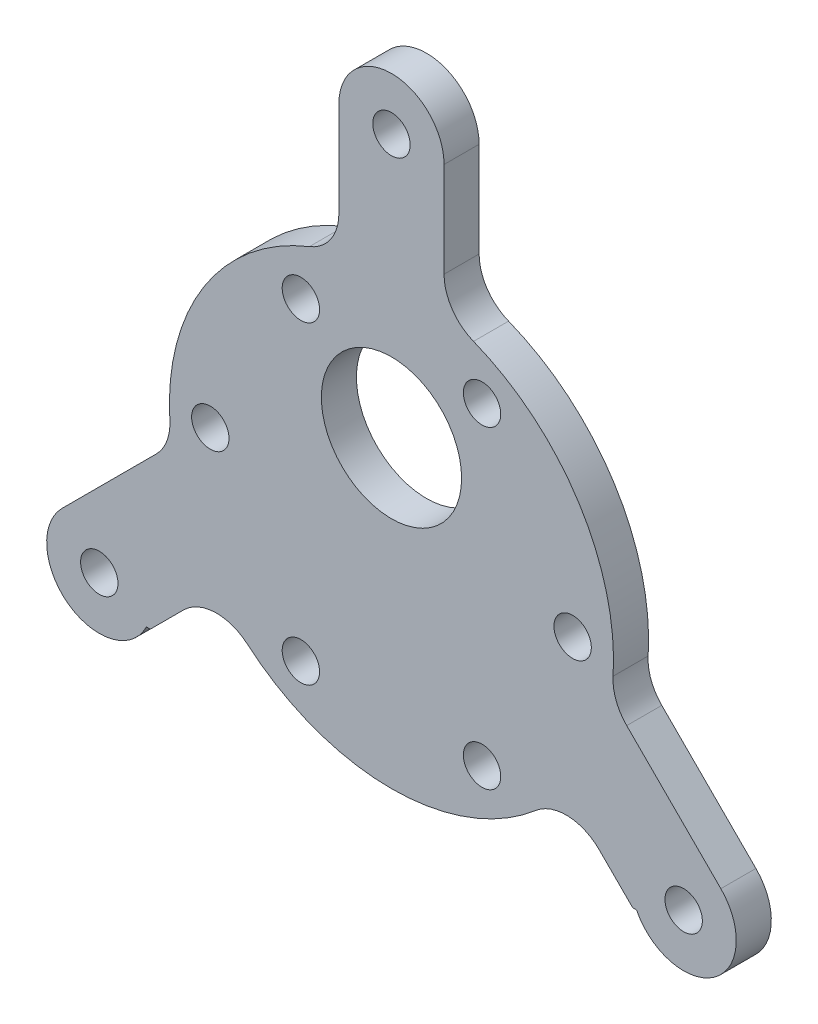
ISO-10303-21;
HEADER;
FILE_DESCRIPTION(('STEP AP214'),'2;1');
FILE_NAME('part.step','',(''),(''),'','','');
FILE_SCHEMA(('AUTOMOTIVE_DESIGN { 1 0 10303 214 1 1 1 1 }'));
ENDSEC;
DATA;
#1=APPLICATION_CONTEXT('core data for automotive mechanical design processes');
#2=APPLICATION_PROTOCOL_DEFINITION('international standard','automotive_design',2000,#1);
#3=PRODUCT_CONTEXT('',#1,'mechanical');
#4=PRODUCT('Part','Part','',(#3));
#5=PRODUCT_RELATED_PRODUCT_CATEGORY('part','',(#4));
#6=PRODUCT_DEFINITION_FORMATION('','',#4);
#7=PRODUCT_DEFINITION_CONTEXT('part definition',#1,'design');
#8=PRODUCT_DEFINITION('design','',#6,#7);
#9=PRODUCT_DEFINITION_SHAPE('','',#8);
#10=(LENGTH_UNIT() NAMED_UNIT(*) SI_UNIT(.MILLI.,.METRE.));
#11=(NAMED_UNIT(*) PLANE_ANGLE_UNIT() SI_UNIT($,.RADIAN.));
#12=(NAMED_UNIT(*) SI_UNIT($,.STERADIAN.) SOLID_ANGLE_UNIT());
#13=UNCERTAINTY_MEASURE_WITH_UNIT(LENGTH_MEASURE(1.E-05),#10,'distance_accuracy_value','');
#14=(GEOMETRIC_REPRESENTATION_CONTEXT(3) GLOBAL_UNCERTAINTY_ASSIGNED_CONTEXT((#13)) GLOBAL_UNIT_ASSIGNED_CONTEXT((#10,
#11,#12)) REPRESENTATION_CONTEXT('',''));
#15=CARTESIAN_POINT('',(0.,0.,0.));
#16=DIRECTION('',(0.,0.,1.));
#17=DIRECTION('',(1.,0.,0.));
#18=AXIS2_PLACEMENT_3D('',#15,#16,#17);
#19=CARTESIAN_POINT('',(20.5680194846604,20.5680194846605,3.));
#20=DIRECTION('',(-0.707106781186546,-0.707106781186549,0.));
#21=DIRECTION('',(0.707106781186549,-0.707106781186546,0.));
#22=AXIS2_PLACEMENT_3D('',#19,#20,#21);
#23=PLANE('',#22);
#24=DIRECTION('',(-0.707106781186549,0.707106781186546,0.));
#25=VECTOR('',#24,1.);
#26=CARTESIAN_POINT('',(20.5680194846604,20.5680194846605,3.));
#27=LINE('',#26,#25);
#28=CARTESIAN_POINT('',(65.6360389693211,-24.5,3.));
#29=VERTEX_POINT('',#28);
#30=CARTESIAN_POINT('',(62.7825614942522,-21.6465225249311,3.));
#31=VERTEX_POINT('',#30);
#32=EDGE_CURVE('E176',#29,#31,#27,.T.);
#33=ORIENTED_EDGE('',*,*,#32,.T.);
#34=DIRECTION('',(0.,0.,-1.));
#35=VECTOR('',#34,1.);
#36=CARTESIAN_POINT('',(62.7825614942522,-21.6465225249311,3.));
#37=LINE('',#36,#35);
#38=CARTESIAN_POINT('',(62.7825614942522,-21.6465225249311,0.));
#39=VERTEX_POINT('',#38);
#40=EDGE_CURVE('E339',#31,#39,#37,.T.);
#41=ORIENTED_EDGE('',*,*,#40,.T.);
#42=DIRECTION('',(-0.707106781186549,0.707106781186546,0.));
#43=VECTOR('',#42,1.);
#44=CARTESIAN_POINT('',(20.5680194846604,20.5680194846605,0.));
#45=LINE('',#44,#43);
#46=CARTESIAN_POINT('',(65.6360389693211,-24.5,0.));
#47=VERTEX_POINT('',#46);
#48=EDGE_CURVE('E179',#47,#39,#45,.T.);
#49=ORIENTED_EDGE('',*,*,#48,.F.);
#50=DIRECTION('',(0.,0.,-1.));
#51=VECTOR('',#50,1.);
#52=CARTESIAN_POINT('',(65.6360389693211,-24.5,3.));
#53=LINE('',#52,#51);
#54=EDGE_CURVE('E172',#29,#47,#53,.T.);
#55=ORIENTED_EDGE('',*,*,#54,.F.);
#56=EDGE_LOOP('',(#33,#41,#49,#55));
#57=FACE_BOUND('',#56,.T.);
#58=ADVANCED_FACE('F35',(#57),#23,.T.);
#59=CARTESIAN_POINT('',(0.,-24.5,3.));
#60=DIRECTION('',(0.,1.,0.));
#61=DIRECTION('',(-1.,0.,0.));
#62=AXIS2_PLACEMENT_3D('',#59,#60,#61);
#63=PLANE('',#62);
#64=DIRECTION('',(1.,0.,0.));
#65=VECTOR('',#64,1.);
#66=CARTESIAN_POINT('',(0.,-24.5,0.));
#67=LINE('',#66,#65);
#68=CARTESIAN_POINT('',(65.9688711258507,-24.5,0.));
#69=VERTEX_POINT('',#68);
#70=EDGE_CURVE('E262',#47,#69,#67,.T.);
#71=ORIENTED_EDGE('',*,*,#70,.T.);
#72=DIRECTION('',(0.,0.,-1.));
#73=VECTOR('',#72,1.);
#74=CARTESIAN_POINT('',(65.9688711258507,-24.5,3.));
#75=LINE('',#74,#73);
#76=CARTESIAN_POINT('',(65.9688711258507,-24.5,3.));
#77=VERTEX_POINT('',#76);
#78=EDGE_CURVE('E183',#77,#69,#75,.T.);
#79=ORIENTED_EDGE('',*,*,#78,.F.);
#80=DIRECTION('',(1.,0.,0.));
#81=VECTOR('',#80,1.);
#82=CARTESIAN_POINT('',(0.,-24.5,3.));
#83=LINE('',#82,#81);
#84=EDGE_CURVE('E186',#29,#77,#83,.T.);
#85=ORIENTED_EDGE('',*,*,#84,.F.);
#86=ORIENTED_EDGE('',*,*,#54,.T.);
#87=EDGE_LOOP('',(#71,#79,#85,#86));
#88=FACE_BOUND('',#87,.T.);
#89=ADVANCED_FACE('F187',(#88),#63,.F.);
#90=CARTESIAN_POINT('',(70.,-22.5,3.));
#91=DIRECTION('',(0.,0.,-1.));
#92=DIRECTION('',(-1.,0.,0.));
#93=AXIS2_PLACEMENT_3D('',#90,#91,#92);
#94=CYLINDRICAL_SURFACE('',#93,4.5);
#95=CARTESIAN_POINT('',(70.,-22.5,0.));
#96=DIRECTION('',(0.,0.,1.));
#97=DIRECTION('',(1.,0.,0.));
#98=AXIS2_PLACEMENT_3D('',#95,#96,#97);
#99=CIRCLE('',#98,4.5);
#100=CARTESIAN_POINT('',(73.1819805153395,-19.3180194846605,0.));
#101=VERTEX_POINT('',#100);
#102=EDGE_CURVE('E264',#69,#101,#99,.T.);
#103=ORIENTED_EDGE('',*,*,#102,.T.);
#104=DIRECTION('',(0.,0.,-1.));
#105=VECTOR('',#104,1.);
#106=CARTESIAN_POINT('',(73.1819805153395,-19.3180194846605,3.));
#107=LINE('',#106,#105);
#108=CARTESIAN_POINT('',(73.1819805153395,-19.3180194846605,3.));
#109=VERTEX_POINT('',#108);
#110=EDGE_CURVE('E329',#109,#101,#107,.T.);
#111=ORIENTED_EDGE('',*,*,#110,.F.);
#112=CARTESIAN_POINT('',(70.,-22.5,3.));
#113=DIRECTION('',(0.,0.,1.));
#114=DIRECTION('',(1.,0.,0.));
#115=AXIS2_PLACEMENT_3D('',#112,#113,#114);
#116=CIRCLE('',#115,4.5);
#117=EDGE_CURVE('E191',#77,#109,#116,.T.);
#118=ORIENTED_EDGE('',*,*,#117,.F.);
#119=ORIENTED_EDGE('',*,*,#78,.T.);
#120=EDGE_LOOP('',(#103,#111,#118,#119));
#121=FACE_BOUND('',#120,.T.);
#122=ADVANCED_FACE('F410',(#121),#94,.T.);
#123=CARTESIAN_POINT('',(26.9319805153393,26.9319805153394,3.));
#124=DIRECTION('',(-0.707106781186546,-0.707106781186548,0.));
#125=DIRECTION('',(0.707106781186549,-0.707106781186546,0.));
#126=AXIS2_PLACEMENT_3D('',#123,#124,#125);
#127=PLANE('',#126);
#128=DIRECTION('',(-0.707106781186549,0.707106781186546,0.));
#129=VECTOR('',#128,1.);
#130=CARTESIAN_POINT('',(26.9319805153393,26.9319805153394,0.));
#131=LINE('',#130,#129);
#132=CARTESIAN_POINT('',(65.1268002113902,-11.2628391807113,0.));
#133=VERTEX_POINT('',#132);
#134=EDGE_CURVE('E266',#101,#133,#131,.T.);
#135=ORIENTED_EDGE('',*,*,#134,.T.);
#136=DIRECTION('',(0.,0.,1.));
#137=VECTOR('',#136,1.);
#138=CARTESIAN_POINT('',(65.1268002113902,-11.2628391807113,3.));
#139=LINE('',#138,#137);
#140=CARTESIAN_POINT('',(65.1268002113902,-11.2628391807113,3.));
#141=VERTEX_POINT('',#140);
#142=EDGE_CURVE('E337',#133,#141,#139,.T.);
#143=ORIENTED_EDGE('',*,*,#142,.T.);
#144=DIRECTION('',(-0.707106781186549,0.707106781186546,0.));
#145=VECTOR('',#144,1.);
#146=CARTESIAN_POINT('',(26.9319805153393,26.9319805153394,3.));
#147=LINE('',#146,#145);
#148=EDGE_CURVE('E205',#109,#141,#147,.T.);
#149=ORIENTED_EDGE('',*,*,#148,.F.);
#150=ORIENTED_EDGE('',*,*,#110,.T.);
#151=EDGE_LOOP('',(#135,#143,#149,#150));
#152=FACE_BOUND('',#151,.T.);
#153=ADVANCED_FACE('F418',(#152),#127,.F.);
#154=CARTESIAN_POINT('',(45.,-7.,3.));
#155=DIRECTION('',(0.,0.,-1.));
#156=DIRECTION('',(-1.,0.,0.));
#157=AXIS2_PLACEMENT_3D('',#154,#155,#156);
#158=CYLINDRICAL_SURFACE('',#157,19.);
#159=CARTESIAN_POINT('',(45.,-7.,3.));
#160=DIRECTION('',(0.,0.,1.));
#161=DIRECTION('',(1.,0.,0.));
#162=AXIS2_PLACEMENT_3D('',#159,#160,#161);
#163=CIRCLE('',#162,19.);
#164=CARTESIAN_POINT('',(63.9630138863735,-8.18494908971029,3.));
#165=VERTEX_POINT('',#164);
#166=CARTESIAN_POINT('',(52.0217391304348,10.6548910952212,3.));
#167=VERTEX_POINT('',#166);
#168=EDGE_CURVE('E208',#165,#167,#163,.T.);
#169=ORIENTED_EDGE('',*,*,#168,.F.);
#170=DIRECTION('',(0.,0.,-1.));
#171=VECTOR('',#170,1.);
#172=CARTESIAN_POINT('',(63.9630138863735,-8.18494908971029,3.));
#173=LINE('',#172,#171);
#174=CARTESIAN_POINT('',(63.9630138863735,-8.18494908971029,0.));
#175=VERTEX_POINT('',#174);
#176=EDGE_CURVE('E334',#165,#175,#173,.T.);
#177=ORIENTED_EDGE('',*,*,#176,.T.);
#178=CARTESIAN_POINT('',(45.,-7.,0.));
#179=DIRECTION('',(0.,0.,1.));
#180=DIRECTION('',(1.,0.,0.));
#181=AXIS2_PLACEMENT_3D('',#178,#179,#180);
#182=CIRCLE('',#181,19.);
#183=CARTESIAN_POINT('',(52.0217391304348,10.6548910952212,0.));
#184=VERTEX_POINT('',#183);
#185=EDGE_CURVE('E269',#175,#184,#182,.T.);
#186=ORIENTED_EDGE('',*,*,#185,.T.);
#187=DIRECTION('',(0.,0.,-1.));
#188=VECTOR('',#187,1.);
#189=CARTESIAN_POINT('',(52.0217391304348,10.6548910952212,3.));
#190=LINE('',#189,#188);
#191=EDGE_CURVE('E182',#184,#167,#190,.F.);
#192=ORIENTED_EDGE('',*,*,#191,.T.);
#193=EDGE_LOOP('',(#169,#177,#186,#192));
#194=FACE_BOUND('',#193,.T.);
#195=ADVANCED_FACE('F396',(#194),#158,.T.);
#196=CARTESIAN_POINT('',(49.5,0.,3.));
#197=DIRECTION('',(1.,0.,0.));
#198=DIRECTION('',(0.,1.,0.));
#199=AXIS2_PLACEMENT_3D('',#196,#197,#198);
#200=PLANE('',#199);
#201=DIRECTION('',(0.,-1.,0.));
#202=VECTOR('',#201,1.);
#203=CARTESIAN_POINT('',(49.5,0.,3.));
#204=LINE('',#203,#202);
#205=CARTESIAN_POINT('',(49.5,22.5,3.));
#206=VERTEX_POINT('',#205);
#207=CARTESIAN_POINT('',(49.5,14.3717102731625,3.));
#208=VERTEX_POINT('',#207);
#209=EDGE_CURVE('E215',#206,#208,#204,.T.);
#210=ORIENTED_EDGE('',*,*,#209,.T.);
#211=DIRECTION('',(0.,0.,-1.));
#212=VECTOR('',#211,1.);
#213=CARTESIAN_POINT('',(49.5,14.3717102731625,3.));
#214=LINE('',#213,#212);
#215=CARTESIAN_POINT('',(49.5,14.3717102731625,0.));
#216=VERTEX_POINT('',#215);
#217=EDGE_CURVE('E356',#208,#216,#214,.T.);
#218=ORIENTED_EDGE('',*,*,#217,.T.);
#219=DIRECTION('',(0.,-1.,0.));
#220=VECTOR('',#219,1.);
#221=CARTESIAN_POINT('',(49.5,0.,0.));
#222=LINE('',#221,#220);
#223=CARTESIAN_POINT('',(49.5,22.5,0.));
#224=VERTEX_POINT('',#223);
#225=EDGE_CURVE('E276',#224,#216,#222,.T.);
#226=ORIENTED_EDGE('',*,*,#225,.F.);
#227=DIRECTION('',(0.,0.,-1.));
#228=VECTOR('',#227,1.);
#229=CARTESIAN_POINT('',(49.5,22.5,3.));
#230=LINE('',#229,#228);
#231=EDGE_CURVE('E327',#206,#224,#230,.T.);
#232=ORIENTED_EDGE('',*,*,#231,.F.);
#233=EDGE_LOOP('',(#210,#218,#226,#232));
#234=FACE_BOUND('',#233,.T.);
#235=ADVANCED_FACE('F386',(#234),#200,.T.);
#236=CARTESIAN_POINT('',(45.,22.5,3.));
#237=DIRECTION('',(0.,0.,-1.));
#238=DIRECTION('',(-1.,0.,0.));
#239=AXIS2_PLACEMENT_3D('',#236,#237,#238);
#240=CYLINDRICAL_SURFACE('',#239,4.5);
#241=CARTESIAN_POINT('',(45.,22.5,0.));
#242=DIRECTION('',(0.,0.,1.));
#243=DIRECTION('',(1.,0.,0.));
#244=AXIS2_PLACEMENT_3D('',#241,#242,#243);
#245=CIRCLE('',#244,4.5);
#246=CARTESIAN_POINT('',(40.5,22.5,0.));
#247=VERTEX_POINT('',#246);
#248=EDGE_CURVE('E279',#224,#247,#245,.T.);
#249=ORIENTED_EDGE('',*,*,#248,.T.);
#250=DIRECTION('',(0.,0.,-1.));
#251=VECTOR('',#250,1.);
#252=CARTESIAN_POINT('',(40.5,22.5,3.));
#253=LINE('',#252,#251);
#254=CARTESIAN_POINT('',(40.5,22.5,3.));
#255=VERTEX_POINT('',#254);
#256=EDGE_CURVE('E324',#255,#247,#253,.T.);
#257=ORIENTED_EDGE('',*,*,#256,.F.);
#258=CARTESIAN_POINT('',(45.,22.5,3.));
#259=DIRECTION('',(0.,0.,1.));
#260=DIRECTION('',(1.,0.,0.));
#261=AXIS2_PLACEMENT_3D('',#258,#259,#260);
#262=CIRCLE('',#261,4.5);
#263=EDGE_CURVE('E218',#206,#255,#262,.T.);
#264=ORIENTED_EDGE('',*,*,#263,.F.);
#265=ORIENTED_EDGE('',*,*,#231,.T.);
#266=EDGE_LOOP('',(#249,#257,#264,#265));
#267=FACE_BOUND('',#266,.T.);
#268=ADVANCED_FACE('F501',(#267),#240,.T.);
#269=CARTESIAN_POINT('',(40.5,0.,3.));
#270=DIRECTION('',(1.,0.,0.));
#271=DIRECTION('',(0.,1.,0.));
#272=AXIS2_PLACEMENT_3D('',#269,#270,#271);
#273=PLANE('',#272);
#274=DIRECTION('',(0.,-1.,0.));
#275=VECTOR('',#274,1.);
#276=CARTESIAN_POINT('',(40.5,0.,0.));
#277=LINE('',#276,#275);
#278=CARTESIAN_POINT('',(40.5,14.3717102731625,0.));
#279=VERTEX_POINT('',#278);
#280=EDGE_CURVE('E274',#247,#279,#277,.T.);
#281=ORIENTED_EDGE('',*,*,#280,.T.);
#282=DIRECTION('',(0.,0.,1.));
#283=VECTOR('',#282,1.);
#284=CARTESIAN_POINT('',(40.5,14.3717102731625,3.));
#285=LINE('',#284,#283);
#286=CARTESIAN_POINT('',(40.5,14.3717102731625,3.));
#287=VERTEX_POINT('',#286);
#288=EDGE_CURVE('E50',#279,#287,#285,.T.);
#289=ORIENTED_EDGE('',*,*,#288,.T.);
#290=DIRECTION('',(0.,-1.,0.));
#291=VECTOR('',#290,1.);
#292=CARTESIAN_POINT('',(40.5,0.,3.));
#293=LINE('',#292,#291);
#294=EDGE_CURVE('E213',#255,#287,#293,.T.);
#295=ORIENTED_EDGE('',*,*,#294,.F.);
#296=ORIENTED_EDGE('',*,*,#256,.T.);
#297=EDGE_LOOP('',(#281,#289,#295,#296));
#298=FACE_BOUND('',#297,.T.);
#299=ADVANCED_FACE('F498',(#298),#273,.F.);
#300=CARTESIAN_POINT('',(37.9782608695652,10.6548910952212,0.));
#301=VERTEX_POINT('',#300);
#302=CARTESIAN_POINT('',(26.0369861136265,-8.18494908971029,0.));
#303=VERTEX_POINT('',#302);
#304=EDGE_CURVE('E270',#301,#303,#182,.T.);
#305=ORIENTED_EDGE('',*,*,#304,.T.);
#306=DIRECTION('',(0.,0.,-1.));
#307=VECTOR('',#306,1.);
#308=CARTESIAN_POINT('',(26.0369861136265,-8.18494908971029,3.));
#309=LINE('',#308,#307);
#310=CARTESIAN_POINT('',(26.0369861136265,-8.18494908971029,3.));
#311=VERTEX_POINT('',#310);
#312=EDGE_CURVE('E354',#303,#311,#309,.F.);
#313=ORIENTED_EDGE('',*,*,#312,.T.);
#314=CARTESIAN_POINT('',(37.9782608695652,10.6548910952212,3.));
#315=VERTEX_POINT('',#314);
#316=EDGE_CURVE('E209',#315,#311,#163,.T.);
#317=ORIENTED_EDGE('',*,*,#316,.F.);
#318=DIRECTION('',(0.,0.,-1.));
#319=VECTOR('',#318,1.);
#320=CARTESIAN_POINT('',(37.9782608695652,10.6548910952212,3.));
#321=LINE('',#320,#319);
#322=EDGE_CURVE('E351',#315,#301,#321,.T.);
#323=ORIENTED_EDGE('',*,*,#322,.T.);
#324=EDGE_LOOP('',(#305,#313,#317,#323));
#325=FACE_BOUND('',#324,.T.);
#326=ADVANCED_FACE('F426',(#325),#158,.T.);
#327=CARTESIAN_POINT('',(18.0680194846605,-18.0680194846606,3.));
#328=DIRECTION('',(-0.707106781186546,0.707106781186548,0.));
#329=DIRECTION('',(-0.707106781186549,-0.707106781186546,0.));
#330=AXIS2_PLACEMENT_3D('',#327,#328,#329);
#331=PLANE('',#330);
#332=DIRECTION('',(0.707106781186549,0.707106781186546,0.));
#333=VECTOR('',#332,1.);
#334=CARTESIAN_POINT('',(18.0680194846605,-18.0680194846606,3.));
#335=LINE('',#334,#333);
#336=CARTESIAN_POINT('',(16.8180194846605,-19.3180194846605,3.));
#337=VERTEX_POINT('',#336);
#338=CARTESIAN_POINT('',(24.8731997886098,-11.2628391807113,3.));
#339=VERTEX_POINT('',#338);
#340=EDGE_CURVE('E212',#337,#339,#335,.T.);
#341=ORIENTED_EDGE('',*,*,#340,.T.);
#342=DIRECTION('',(0.,0.,-1.));
#343=VECTOR('',#342,1.);
#344=CARTESIAN_POINT('',(24.8731997886098,-11.2628391807113,3.));
#345=LINE('',#344,#343);
#346=CARTESIAN_POINT('',(24.8731997886098,-11.2628391807113,0.));
#347=VERTEX_POINT('',#346);
#348=EDGE_CURVE('E348',#339,#347,#345,.T.);
#349=ORIENTED_EDGE('',*,*,#348,.T.);
#350=DIRECTION('',(0.707106781186549,0.707106781186546,0.));
#351=VECTOR('',#350,1.);
#352=CARTESIAN_POINT('',(18.0680194846605,-18.0680194846606,0.));
#353=LINE('',#352,#351);
#354=CARTESIAN_POINT('',(16.8180194846605,-19.3180194846605,0.));
#355=VERTEX_POINT('',#354);
#356=EDGE_CURVE('E273',#355,#347,#353,.T.);
#357=ORIENTED_EDGE('',*,*,#356,.F.);
#358=DIRECTION('',(0.,0.,-1.));
#359=VECTOR('',#358,1.);
#360=CARTESIAN_POINT('',(16.8180194846605,-19.3180194846605,3.));
#361=LINE('',#360,#359);
#362=EDGE_CURVE('E322',#337,#355,#361,.T.);
#363=ORIENTED_EDGE('',*,*,#362,.F.);
#364=EDGE_LOOP('',(#341,#349,#357,#363));
#365=FACE_BOUND('',#364,.T.);
#366=ADVANCED_FACE('F463',(#365),#331,.T.);
#367=CARTESIAN_POINT('',(20.,-22.5,3.));
#368=DIRECTION('',(0.,0.,-1.));
#369=DIRECTION('',(-1.,0.,0.));
#370=AXIS2_PLACEMENT_3D('',#367,#368,#369);
#371=CYLINDRICAL_SURFACE('',#370,4.5);
#372=CARTESIAN_POINT('',(20.,-22.5,0.));
#373=DIRECTION('',(0.,0.,1.));
#374=DIRECTION('',(1.,0.,0.));
#375=AXIS2_PLACEMENT_3D('',#372,#373,#374);
#376=CIRCLE('',#375,4.5);
#377=CARTESIAN_POINT('',(24.0311288741493,-24.5,0.));
#378=VERTEX_POINT('',#377);
#379=EDGE_CURVE('E284',#355,#378,#376,.T.);
#380=ORIENTED_EDGE('',*,*,#379,.T.);
#381=DIRECTION('',(0.,0.,-1.));
#382=VECTOR('',#381,1.);
#383=CARTESIAN_POINT('',(24.0311288741493,-24.5,3.));
#384=LINE('',#383,#382);
#385=CARTESIAN_POINT('',(24.0311288741493,-24.5,3.));
#386=VERTEX_POINT('',#385);
#387=EDGE_CURVE('E319',#386,#378,#384,.T.);
#388=ORIENTED_EDGE('',*,*,#387,.F.);
#389=CARTESIAN_POINT('',(20.,-22.5,3.));
#390=DIRECTION('',(0.,0.,1.));
#391=DIRECTION('',(1.,0.,0.));
#392=AXIS2_PLACEMENT_3D('',#389,#390,#391);
#393=CIRCLE('',#392,4.5);
#394=EDGE_CURVE('E223',#337,#386,#393,.T.);
#395=ORIENTED_EDGE('',*,*,#394,.F.);
#396=ORIENTED_EDGE('',*,*,#362,.T.);
#397=EDGE_LOOP('',(#380,#388,#395,#396));
#398=FACE_BOUND('',#397,.T.);
#399=ADVANCED_FACE('F469',(#398),#371,.T.);
#400=CARTESIAN_POINT('',(0.,-24.5,3.));
#401=DIRECTION('',(0.,1.,0.));
#402=DIRECTION('',(-1.,0.,0.));
#403=AXIS2_PLACEMENT_3D('',#400,#401,#402);
#404=PLANE('',#403);
#405=DIRECTION('',(1.,0.,0.));
#406=VECTOR('',#405,1.);
#407=CARTESIAN_POINT('',(0.,-24.5,0.));
#408=LINE('',#407,#406);
#409=CARTESIAN_POINT('',(24.3639610306789,-24.5,0.));
#410=VERTEX_POINT('',#409);
#411=EDGE_CURVE('E286',#378,#410,#408,.T.);
#412=ORIENTED_EDGE('',*,*,#411,.T.);
#413=DIRECTION('',(0.,0.,-1.));
#414=VECTOR('',#413,1.);
#415=CARTESIAN_POINT('',(24.3639610306789,-24.5,3.));
#416=LINE('',#415,#414);
#417=CARTESIAN_POINT('',(24.3639610306789,-24.5,3.));
#418=VERTEX_POINT('',#417);
#419=EDGE_CURVE('E260',#418,#410,#416,.T.);
#420=ORIENTED_EDGE('',*,*,#419,.F.);
#421=DIRECTION('',(1.,0.,0.));
#422=VECTOR('',#421,1.);
#423=CARTESIAN_POINT('',(0.,-24.5,3.));
#424=LINE('',#423,#422);
#425=EDGE_CURVE('E225',#386,#418,#424,.T.);
#426=ORIENTED_EDGE('',*,*,#425,.F.);
#427=ORIENTED_EDGE('',*,*,#387,.T.);
#428=EDGE_LOOP('',(#412,#420,#426,#427));
#429=FACE_BOUND('',#428,.T.);
#430=ADVANCED_FACE('F475',(#429),#404,.F.);
#431=CARTESIAN_POINT('',(24.4319805153394,-24.4319805153395,3.));
#432=DIRECTION('',(-0.707106781186546,0.707106781186549,0.));
#433=DIRECTION('',(-0.707106781186549,-0.707106781186546,0.));
#434=AXIS2_PLACEMENT_3D('',#431,#432,#433);
#435=PLANE('',#434);
#436=DIRECTION('',(0.707106781186549,0.707106781186546,0.));
#437=VECTOR('',#436,1.);
#438=CARTESIAN_POINT('',(24.4319805153394,-24.4319805153395,0.));
#439=LINE('',#438,#437);
#440=CARTESIAN_POINT('',(27.2174385057478,-21.6465225249312,0.));
#441=VERTEX_POINT('',#440);
#442=EDGE_CURVE('E288',#410,#441,#439,.T.);
#443=ORIENTED_EDGE('',*,*,#442,.T.);
#444=DIRECTION('',(0.,0.,1.));
#445=VECTOR('',#444,1.);
#446=CARTESIAN_POINT('',(27.2174385057478,-21.6465225249312,3.));
#447=LINE('',#446,#445);
#448=CARTESIAN_POINT('',(27.2174385057478,-21.6465225249312,3.));
#449=VERTEX_POINT('',#448);
#450=EDGE_CURVE('E346',#441,#449,#447,.T.);
#451=ORIENTED_EDGE('',*,*,#450,.T.);
#452=DIRECTION('',(0.707106781186549,0.707106781186546,0.));
#453=VECTOR('',#452,1.);
#454=CARTESIAN_POINT('',(24.4319805153394,-24.4319805153395,3.));
#455=LINE('',#454,#453);
#456=EDGE_CURVE('E227',#418,#449,#455,.T.);
#457=ORIENTED_EDGE('',*,*,#456,.F.);
#458=ORIENTED_EDGE('',*,*,#419,.T.);
#459=EDGE_LOOP('',(#443,#451,#457,#458));
#460=FACE_BOUND('',#459,.T.);
#461=ADVANCED_FACE('F479',(#460),#435,.F.);
#462=CARTESIAN_POINT('',(45.,22.5,3.));
#463=DIRECTION('',(0.,0.,-1.));
#464=DIRECTION('',(-1.,0.,0.));
#465=AXIS2_PLACEMENT_3D('',#462,#463,#464);
#466=CYLINDRICAL_SURFACE('',#465,1.6);
#467=CARTESIAN_POINT('',(45.,22.5,3.));
#468=DIRECTION('',(0.,0.,1.));
#469=DIRECTION('',(1.,0.,0.));
#470=AXIS2_PLACEMENT_3D('',#467,#468,#469);
#471=CIRCLE('',#470,1.6);
#472=CARTESIAN_POINT('',(46.6,22.5,3.));
#473=VERTEX_POINT('',#472);
#474=EDGE_CURVE('E254',#473,#473,#471,.T.);
#475=ORIENTED_EDGE('',*,*,#474,.T.);
#476=EDGE_LOOP('',(#475));
#477=FACE_BOUND('',#476,.T.);
#478=CARTESIAN_POINT('',(45.,22.5,0.));
#479=DIRECTION('',(0.,0.,1.));
#480=DIRECTION('',(1.,0.,0.));
#481=AXIS2_PLACEMENT_3D('',#478,#479,#480);
#482=CIRCLE('',#481,1.6);
#483=CARTESIAN_POINT('',(46.6,22.5,0.));
#484=VERTEX_POINT('',#483);
#485=EDGE_CURVE('E201',#484,#484,#482,.T.);
#486=ORIENTED_EDGE('',*,*,#485,.F.);
#487=EDGE_LOOP('',(#486));
#488=FACE_BOUND('',#487,.T.);
#489=ADVANCED_FACE('F482',(#477,#488),#466,.F.);
#490=CARTESIAN_POINT('',(45.,0.,3.));
#491=DIRECTION('',(0.,0.,-1.));
#492=DIRECTION('',(-1.,0.,0.));
#493=AXIS2_PLACEMENT_3D('',#490,#491,#492);
#494=CYLINDRICAL_SURFACE('',#493,6.);
#495=CARTESIAN_POINT('',(45.,0.,3.));
#496=DIRECTION('',(0.,0.,1.));
#497=DIRECTION('',(1.,0.,0.));
#498=AXIS2_PLACEMENT_3D('',#495,#496,#497);
#499=CIRCLE('',#498,6.);
#500=CARTESIAN_POINT('',(51.,0.,3.));
#501=VERTEX_POINT('',#500);
#502=EDGE_CURVE('E251',#501,#501,#499,.T.);
#503=ORIENTED_EDGE('',*,*,#502,.T.);
#504=EDGE_LOOP('',(#503));
#505=FACE_BOUND('',#504,.T.);
#506=CARTESIAN_POINT('',(45.,0.,0.));
#507=DIRECTION('',(0.,0.,1.));
#508=DIRECTION('',(1.,0.,0.));
#509=AXIS2_PLACEMENT_3D('',#506,#507,#508);
#510=CIRCLE('',#509,6.);
#511=CARTESIAN_POINT('',(51.,0.,0.));
#512=VERTEX_POINT('',#511);
#513=EDGE_CURVE('E312',#512,#512,#510,.T.);
#514=ORIENTED_EDGE('',*,*,#513,.F.);
#515=EDGE_LOOP('',(#514));
#516=FACE_BOUND('',#515,.T.);
#517=ADVANCED_FACE('F488',(#505,#516),#494,.F.);
#518=CARTESIAN_POINT('',(29.5,-7.,3.));
#519=DIRECTION('',(0.,0.,-1.));
#520=DIRECTION('',(-1.,0.,0.));
#521=AXIS2_PLACEMENT_3D('',#518,#519,#520);
#522=CYLINDRICAL_SURFACE('',#521,1.6);
#523=CARTESIAN_POINT('',(29.5,-7.,3.));
#524=DIRECTION('',(0.,0.,1.));
#525=DIRECTION('',(1.,0.,0.));
#526=AXIS2_PLACEMENT_3D('',#523,#524,#525);
#527=CIRCLE('',#526,1.6);
#528=CARTESIAN_POINT('',(31.1,-7.,3.));
#529=VERTEX_POINT('',#528);
#530=EDGE_CURVE('E248',#529,#529,#527,.T.);
#531=ORIENTED_EDGE('',*,*,#530,.T.);
#532=EDGE_LOOP('',(#531));
#533=FACE_BOUND('',#532,.T.);
#534=CARTESIAN_POINT('',(29.5,-7.,0.));
#535=DIRECTION('',(0.,0.,1.));
#536=DIRECTION('',(1.,0.,0.));
#537=AXIS2_PLACEMENT_3D('',#534,#535,#536);
#538=CIRCLE('',#537,1.6);
#539=CARTESIAN_POINT('',(31.1,-7.,0.));
#540=VERTEX_POINT('',#539);
#541=EDGE_CURVE('E309',#540,#540,#538,.T.);
#542=ORIENTED_EDGE('',*,*,#541,.F.);
#543=EDGE_LOOP('',(#542));
#544=FACE_BOUND('',#543,.T.);
#545=ADVANCED_FACE('F551',(#533,#544),#522,.F.);
#546=CARTESIAN_POINT('',(37.25,6.42339375865882,3.));
#547=DIRECTION('',(0.,0.,-1.));
#548=DIRECTION('',(-1.,0.,0.));
#549=AXIS2_PLACEMENT_3D('',#546,#547,#548);
#550=CYLINDRICAL_SURFACE('',#549,1.6);
#551=CARTESIAN_POINT('',(37.25,6.42339375865882,3.));
#552=DIRECTION('',(0.,0.,1.));
#553=DIRECTION('',(1.,0.,0.));
#554=AXIS2_PLACEMENT_3D('',#551,#552,#553);
#555=CIRCLE('',#554,1.6);
#556=CARTESIAN_POINT('',(38.85,6.42339375865882,3.));
#557=VERTEX_POINT('',#556);
#558=EDGE_CURVE('E245',#557,#557,#555,.T.);
#559=ORIENTED_EDGE('',*,*,#558,.T.);
#560=EDGE_LOOP('',(#559));
#561=FACE_BOUND('',#560,.T.);
#562=CARTESIAN_POINT('',(37.25,6.42339375865882,0.));
#563=DIRECTION('',(0.,0.,1.));
#564=DIRECTION('',(1.,0.,0.));
#565=AXIS2_PLACEMENT_3D('',#562,#563,#564);
#566=CIRCLE('',#565,1.6);
#567=CARTESIAN_POINT('',(38.85,6.42339375865882,0.));
#568=VERTEX_POINT('',#567);
#569=EDGE_CURVE('E306',#568,#568,#566,.T.);
#570=ORIENTED_EDGE('',*,*,#569,.F.);
#571=EDGE_LOOP('',(#570));
#572=FACE_BOUND('',#571,.T.);
#573=ADVANCED_FACE('F561',(#561,#572),#550,.F.);
#574=CARTESIAN_POINT('',(52.7500000000001,6.42339375865877,3.));
#575=DIRECTION('',(0.,0.,-1.));
#576=DIRECTION('',(-1.,0.,0.));
#577=AXIS2_PLACEMENT_3D('',#574,#575,#576);
#578=CYLINDRICAL_SURFACE('',#577,1.6);
#579=CARTESIAN_POINT('',(52.7500000000001,6.42339375865877,3.));
#580=DIRECTION('',(0.,0.,1.));
#581=DIRECTION('',(1.,0.,0.));
#582=AXIS2_PLACEMENT_3D('',#579,#580,#581);
#583=CIRCLE('',#582,1.6);
#584=CARTESIAN_POINT('',(54.3500000000001,6.42339375865877,3.));
#585=VERTEX_POINT('',#584);
#586=EDGE_CURVE('E242',#585,#585,#583,.T.);
#587=ORIENTED_EDGE('',*,*,#586,.T.);
#588=EDGE_LOOP('',(#587));
#589=FACE_BOUND('',#588,.T.);
#590=CARTESIAN_POINT('',(52.7500000000001,6.42339375865877,0.));
#591=DIRECTION('',(0.,0.,1.));
#592=DIRECTION('',(1.,0.,0.));
#593=AXIS2_PLACEMENT_3D('',#590,#591,#592);
#594=CIRCLE('',#593,1.6);
#595=CARTESIAN_POINT('',(54.3500000000001,6.42339375865877,0.));
#596=VERTEX_POINT('',#595);
#597=EDGE_CURVE('E303',#596,#596,#594,.T.);
#598=ORIENTED_EDGE('',*,*,#597,.F.);
#599=EDGE_LOOP('',(#598));
#600=FACE_BOUND('',#599,.T.);
#601=ADVANCED_FACE('F571',(#589,#600),#578,.F.);
#602=CARTESIAN_POINT('',(60.5,-7.00000000000011,3.));
#603=DIRECTION('',(0.,0.,-1.));
#604=DIRECTION('',(-1.,0.,0.));
#605=AXIS2_PLACEMENT_3D('',#602,#603,#604);
#606=CYLINDRICAL_SURFACE('',#605,1.6);
#607=CARTESIAN_POINT('',(60.5,-7.00000000000011,3.));
#608=DIRECTION('',(0.,0.,1.));
#609=DIRECTION('',(1.,0.,0.));
#610=AXIS2_PLACEMENT_3D('',#607,#608,#609);
#611=CIRCLE('',#610,1.6);
#612=CARTESIAN_POINT('',(62.1,-7.00000000000011,3.));
#613=VERTEX_POINT('',#612);
#614=EDGE_CURVE('E239',#613,#613,#611,.T.);
#615=ORIENTED_EDGE('',*,*,#614,.T.);
#616=EDGE_LOOP('',(#615));
#617=FACE_BOUND('',#616,.T.);
#618=CARTESIAN_POINT('',(60.5,-7.00000000000011,0.));
#619=DIRECTION('',(0.,0.,1.));
#620=DIRECTION('',(1.,0.,0.));
#621=AXIS2_PLACEMENT_3D('',#618,#619,#620);
#622=CIRCLE('',#621,1.6);
#623=CARTESIAN_POINT('',(62.1,-7.00000000000011,0.));
#624=VERTEX_POINT('',#623);
#625=EDGE_CURVE('E300',#624,#624,#622,.T.);
#626=ORIENTED_EDGE('',*,*,#625,.F.);
#627=EDGE_LOOP('',(#626));
#628=FACE_BOUND('',#627,.T.);
#629=ADVANCED_FACE('F581',(#617,#628),#606,.F.);
#630=CARTESIAN_POINT('',(52.7499999999999,-20.4233937586589,3.));
#631=DIRECTION('',(0.,0.,-1.));
#632=DIRECTION('',(-1.,0.,0.));
#633=AXIS2_PLACEMENT_3D('',#630,#631,#632);
#634=CYLINDRICAL_SURFACE('',#633,1.6);
#635=CARTESIAN_POINT('',(52.7499999999999,-20.4233937586589,3.));
#636=DIRECTION('',(0.,0.,1.));
#637=DIRECTION('',(1.,0.,0.));
#638=AXIS2_PLACEMENT_3D('',#635,#636,#637);
#639=CIRCLE('',#638,1.6);
#640=CARTESIAN_POINT('',(54.3499999999999,-20.4233937586589,3.));
#641=VERTEX_POINT('',#640);
#642=EDGE_CURVE('E236',#641,#641,#639,.T.);
#643=ORIENTED_EDGE('',*,*,#642,.T.);
#644=EDGE_LOOP('',(#643));
#645=FACE_BOUND('',#644,.T.);
#646=CARTESIAN_POINT('',(52.7499999999999,-20.4233937586589,0.));
#647=DIRECTION('',(0.,0.,1.));
#648=DIRECTION('',(1.,0.,0.));
#649=AXIS2_PLACEMENT_3D('',#646,#647,#648);
#650=CIRCLE('',#649,1.6);
#651=CARTESIAN_POINT('',(54.3499999999999,-20.4233937586589,0.));
#652=VERTEX_POINT('',#651);
#653=EDGE_CURVE('E297',#652,#652,#650,.T.);
#654=ORIENTED_EDGE('',*,*,#653,.F.);
#655=EDGE_LOOP('',(#654));
#656=FACE_BOUND('',#655,.T.);
#657=ADVANCED_FACE('F591',(#645,#656),#634,.F.);
#658=CARTESIAN_POINT('',(37.2499999999998,-20.4233937586587,3.));
#659=DIRECTION('',(0.,0.,-1.));
#660=DIRECTION('',(-1.,0.,0.));
#661=AXIS2_PLACEMENT_3D('',#658,#659,#660);
#662=CYLINDRICAL_SURFACE('',#661,1.6);
#663=CARTESIAN_POINT('',(37.2499999999998,-20.4233937586587,3.));
#664=DIRECTION('',(0.,0.,1.));
#665=DIRECTION('',(1.,0.,0.));
#666=AXIS2_PLACEMENT_3D('',#663,#664,#665);
#667=CIRCLE('',#666,1.6);
#668=CARTESIAN_POINT('',(38.8499999999998,-20.4233937586587,3.));
#669=VERTEX_POINT('',#668);
#670=EDGE_CURVE('E233',#669,#669,#667,.T.);
#671=ORIENTED_EDGE('',*,*,#670,.T.);
#672=EDGE_LOOP('',(#671));
#673=FACE_BOUND('',#672,.T.);
#674=CARTESIAN_POINT('',(37.2499999999998,-20.4233937586587,0.));
#675=DIRECTION('',(0.,0.,1.));
#676=DIRECTION('',(1.,0.,0.));
#677=AXIS2_PLACEMENT_3D('',#674,#675,#676);
#678=CIRCLE('',#677,1.6);
#679=CARTESIAN_POINT('',(38.8499999999998,-20.4233937586587,0.));
#680=VERTEX_POINT('',#679);
#681=EDGE_CURVE('E294',#680,#680,#678,.T.);
#682=ORIENTED_EDGE('',*,*,#681,.F.);
#683=EDGE_LOOP('',(#682));
#684=FACE_BOUND('',#683,.T.);
#685=ADVANCED_FACE('F601',(#673,#684),#662,.F.);
#686=CARTESIAN_POINT('',(70.,-22.5,3.));
#687=DIRECTION('',(0.,0.,-1.));
#688=DIRECTION('',(-1.,0.,0.));
#689=AXIS2_PLACEMENT_3D('',#686,#687,#688);
#690=CYLINDRICAL_SURFACE('',#689,1.6);
#691=CARTESIAN_POINT('',(70.,-22.5,3.));
#692=DIRECTION('',(0.,0.,1.));
#693=DIRECTION('',(1.,0.,0.));
#694=AXIS2_PLACEMENT_3D('',#691,#692,#693);
#695=CIRCLE('',#694,1.6);
#696=CARTESIAN_POINT('',(71.6,-22.5,3.));
#697=VERTEX_POINT('',#696);
#698=EDGE_CURVE('E230',#697,#697,#695,.T.);
#699=ORIENTED_EDGE('',*,*,#698,.T.);
#700=EDGE_LOOP('',(#699));
#701=FACE_BOUND('',#700,.T.);
#702=CARTESIAN_POINT('',(70.,-22.5,0.));
#703=DIRECTION('',(0.,0.,1.));
#704=DIRECTION('',(1.,0.,0.));
#705=AXIS2_PLACEMENT_3D('',#702,#703,#704);
#706=CIRCLE('',#705,1.6);
#707=CARTESIAN_POINT('',(71.6,-22.5,0.));
#708=VERTEX_POINT('',#707);
#709=EDGE_CURVE('E291',#708,#708,#706,.T.);
#710=ORIENTED_EDGE('',*,*,#709,.F.);
#711=EDGE_LOOP('',(#710));
#712=FACE_BOUND('',#711,.T.);
#713=ADVANCED_FACE('F611',(#701,#712),#690,.F.);
#714=CARTESIAN_POINT('',(32.6465846512776,-21.4358279714726,0.));
#715=VERTEX_POINT('',#714);
#716=CARTESIAN_POINT('',(57.3534153487224,-21.4358279714726,0.));
#717=VERTEX_POINT('',#716);
#718=EDGE_CURVE('E275',#715,#717,#182,.T.);
#719=ORIENTED_EDGE('',*,*,#718,.T.);
#720=DIRECTION('',(0.,0.,-1.));
#721=VECTOR('',#720,1.);
#722=CARTESIAN_POINT('',(57.3534153487224,-21.4358279714726,3.));
#723=LINE('',#722,#721);
#724=CARTESIAN_POINT('',(57.3534153487224,-21.4358279714726,3.));
#725=VERTEX_POINT('',#724);
#726=EDGE_CURVE('E344',#717,#725,#723,.F.);
#727=ORIENTED_EDGE('',*,*,#726,.T.);
#728=CARTESIAN_POINT('',(32.6465846512776,-21.4358279714726,3.));
#729=VERTEX_POINT('',#728);
#730=EDGE_CURVE('E214',#729,#725,#163,.T.);
#731=ORIENTED_EDGE('',*,*,#730,.F.);
#732=DIRECTION('',(0.,0.,-1.));
#733=VECTOR('',#732,1.);
#734=CARTESIAN_POINT('',(32.6465846512776,-21.4358279714726,3.));
#735=LINE('',#734,#733);
#736=EDGE_CURVE('E341',#729,#715,#735,.T.);
#737=ORIENTED_EDGE('',*,*,#736,.T.);
#738=EDGE_LOOP('',(#719,#727,#731,#737));
#739=FACE_BOUND('',#738,.T.);
#740=ADVANCED_FACE('F402',(#739),#158,.T.);
#741=CARTESIAN_POINT('',(20.,-22.5,3.));
#742=DIRECTION('',(0.,0.,-1.));
#743=DIRECTION('',(-1.,0.,0.));
#744=AXIS2_PLACEMENT_3D('',#741,#742,#743);
#745=CYLINDRICAL_SURFACE('',#744,1.6);
#746=CARTESIAN_POINT('',(20.,-22.5,3.));
#747=DIRECTION('',(0.,0.,1.));
#748=DIRECTION('',(1.,0.,0.));
#749=AXIS2_PLACEMENT_3D('',#746,#747,#748);
#750=CIRCLE('',#749,1.6);
#751=CARTESIAN_POINT('',(21.6,-22.5,3.));
#752=VERTEX_POINT('',#751);
#753=EDGE_CURVE('E257',#752,#752,#750,.T.);
#754=ORIENTED_EDGE('',*,*,#753,.T.);
#755=EDGE_LOOP('',(#754));
#756=FACE_BOUND('',#755,.T.);
#757=CARTESIAN_POINT('',(20.,-22.5,0.));
#758=DIRECTION('',(0.,0.,1.));
#759=DIRECTION('',(1.,0.,0.));
#760=AXIS2_PLACEMENT_3D('',#757,#758,#759);
#761=CIRCLE('',#760,1.6);
#762=CARTESIAN_POINT('',(21.6,-22.5,0.));
#763=VERTEX_POINT('',#762);
#764=EDGE_CURVE('E198',#763,#763,#761,.T.);
#765=ORIENTED_EDGE('',*,*,#764,.F.);
#766=EDGE_LOOP('',(#765));
#767=FACE_BOUND('',#766,.T.);
#768=ADVANCED_FACE('F627',(#756,#767),#745,.F.);
#769=CARTESIAN_POINT('',(0.,0.,3.));
#770=DIRECTION('',(0.,0.,1.));
#771=DIRECTION('',(1.,0.,0.));
#772=AXIS2_PLACEMENT_3D('',#769,#770,#771);
#773=PLANE('',#772);
#774=ORIENTED_EDGE('',*,*,#32,.F.);
#775=ORIENTED_EDGE('',*,*,#84,.T.);
#776=ORIENTED_EDGE('',*,*,#117,.T.);
#777=ORIENTED_EDGE('',*,*,#148,.T.);
#778=CARTESIAN_POINT('',(67.9552273361363,-8.43441205596509,3.));
#779=DIRECTION('',(0.,0.,1.));
#780=DIRECTION('',(1.,0.,0.));
#781=AXIS2_PLACEMENT_3D('',#778,#779,#780);
#782=CIRCLE('',#781,4.);
#783=EDGE_CURVE('E362',#141,#165,#782,.F.);
#784=ORIENTED_EDGE('',*,*,#783,.T.);
#785=ORIENTED_EDGE('',*,*,#168,.T.);
#786=CARTESIAN_POINT('',(53.5,14.3717102731625,3.));
#787=DIRECTION('',(0.,0.,1.));
#788=DIRECTION('',(1.,0.,0.));
#789=AXIS2_PLACEMENT_3D('',#786,#787,#788);
#790=CIRCLE('',#789,4.);
#791=EDGE_CURVE('E377',#167,#208,#790,.F.);
#792=ORIENTED_EDGE('',*,*,#791,.T.);
#793=ORIENTED_EDGE('',*,*,#209,.F.);
#794=ORIENTED_EDGE('',*,*,#263,.T.);
#795=ORIENTED_EDGE('',*,*,#294,.T.);
#796=CARTESIAN_POINT('',(36.5,14.3717102731625,3.));
#797=DIRECTION('',(0.,0.,1.));
#798=DIRECTION('',(1.,0.,0.));
#799=AXIS2_PLACEMENT_3D('',#796,#797,#798);
#800=CIRCLE('',#799,4.);
#801=EDGE_CURVE('E11',#287,#315,#800,.F.);
#802=ORIENTED_EDGE('',*,*,#801,.T.);
#803=ORIENTED_EDGE('',*,*,#316,.T.);
#804=CARTESIAN_POINT('',(22.0447726638636,-8.43441205596509,3.));
#805=DIRECTION('',(0.,0.,1.));
#806=DIRECTION('',(1.,0.,0.));
#807=AXIS2_PLACEMENT_3D('',#804,#805,#806);
#808=CIRCLE('',#807,4.);
#809=EDGE_CURVE('E373',#311,#339,#808,.F.);
#810=ORIENTED_EDGE('',*,*,#809,.T.);
#811=ORIENTED_EDGE('',*,*,#340,.F.);
#812=ORIENTED_EDGE('',*,*,#394,.T.);
#813=ORIENTED_EDGE('',*,*,#425,.T.);
#814=ORIENTED_EDGE('',*,*,#456,.T.);
#815=CARTESIAN_POINT('',(30.045865630494,-24.4749496496774,3.));
#816=DIRECTION('',(0.,0.,1.));
#817=DIRECTION('',(1.,0.,0.));
#818=AXIS2_PLACEMENT_3D('',#815,#816,#817);
#819=CIRCLE('',#818,4.);
#820=EDGE_CURVE('E369',#449,#729,#819,.F.);
#821=ORIENTED_EDGE('',*,*,#820,.T.);
#822=ORIENTED_EDGE('',*,*,#730,.T.);
#823=CARTESIAN_POINT('',(59.954134369506,-24.4749496496773,3.));
#824=DIRECTION('',(0.,0.,1.));
#825=DIRECTION('',(1.,0.,0.));
#826=AXIS2_PLACEMENT_3D('',#823,#824,#825);
#827=CIRCLE('',#826,4.);
#828=EDGE_CURVE('E197',#725,#31,#827,.F.);
#829=ORIENTED_EDGE('',*,*,#828,.T.);
#830=EDGE_LOOP('',(#774,#775,#776,#777,#784,#785,#792,#793,#794,#795,#802,#803,#810,#811,#812,
#813,#814,#821,#822,#829));
#831=FACE_BOUND('',#830,.T.);
#832=ORIENTED_EDGE('',*,*,#698,.F.);
#833=EDGE_LOOP('',(#832));
#834=FACE_BOUND('',#833,.T.);
#835=ORIENTED_EDGE('',*,*,#670,.F.);
#836=EDGE_LOOP('',(#835));
#837=FACE_BOUND('',#836,.T.);
#838=ORIENTED_EDGE('',*,*,#642,.F.);
#839=EDGE_LOOP('',(#838));
#840=FACE_BOUND('',#839,.T.);
#841=ORIENTED_EDGE('',*,*,#614,.F.);
#842=EDGE_LOOP('',(#841));
#843=FACE_BOUND('',#842,.T.);
#844=ORIENTED_EDGE('',*,*,#586,.F.);
#845=EDGE_LOOP('',(#844));
#846=FACE_BOUND('',#845,.T.);
#847=ORIENTED_EDGE('',*,*,#558,.F.);
#848=EDGE_LOOP('',(#847));
#849=FACE_BOUND('',#848,.T.);
#850=ORIENTED_EDGE('',*,*,#530,.F.);
#851=EDGE_LOOP('',(#850));
#852=FACE_BOUND('',#851,.T.);
#853=ORIENTED_EDGE('',*,*,#502,.F.);
#854=EDGE_LOOP('',(#853));
#855=FACE_BOUND('',#854,.T.);
#856=ORIENTED_EDGE('',*,*,#474,.F.);
#857=EDGE_LOOP('',(#856));
#858=FACE_BOUND('',#857,.T.);
#859=ORIENTED_EDGE('',*,*,#753,.F.);
#860=EDGE_LOOP('',(#859));
#861=FACE_BOUND('',#860,.T.);
#862=ADVANCED_FACE('F193',(#831,#834,#837,#840,#843,#846,#849,#852,#855,#858,#861),#773,.T.);
#863=CARTESIAN_POINT('',(0.,0.,0.));
#864=DIRECTION('',(0.,0.,1.));
#865=DIRECTION('',(1.,0.,0.));
#866=AXIS2_PLACEMENT_3D('',#863,#864,#865);
#867=PLANE('',#866);
#868=ORIENTED_EDGE('',*,*,#48,.T.);
#869=CARTESIAN_POINT('',(59.954134369506,-24.4749496496773,0.));
#870=DIRECTION('',(0.,0.,1.));
#871=DIRECTION('',(1.,0.,0.));
#872=AXIS2_PLACEMENT_3D('',#869,#870,#871);
#873=CIRCLE('',#872,4.);
#874=EDGE_CURVE('E364',#39,#717,#873,.T.);
#875=ORIENTED_EDGE('',*,*,#874,.T.);
#876=ORIENTED_EDGE('',*,*,#718,.F.);
#877=CARTESIAN_POINT('',(30.045865630494,-24.4749496496774,0.));
#878=DIRECTION('',(0.,0.,1.));
#879=DIRECTION('',(1.,0.,0.));
#880=AXIS2_PLACEMENT_3D('',#877,#878,#879);
#881=CIRCLE('',#880,4.);
#882=EDGE_CURVE('E367',#715,#441,#881,.T.);
#883=ORIENTED_EDGE('',*,*,#882,.T.);
#884=ORIENTED_EDGE('',*,*,#442,.F.);
#885=ORIENTED_EDGE('',*,*,#411,.F.);
#886=ORIENTED_EDGE('',*,*,#379,.F.);
#887=ORIENTED_EDGE('',*,*,#356,.T.);
#888=CARTESIAN_POINT('',(22.0447726638636,-8.43441205596509,0.));
#889=DIRECTION('',(0.,0.,1.));
#890=DIRECTION('',(1.,0.,0.));
#891=AXIS2_PLACEMENT_3D('',#888,#889,#890);
#892=CIRCLE('',#891,4.);
#893=EDGE_CURVE('E371',#347,#303,#892,.T.);
#894=ORIENTED_EDGE('',*,*,#893,.T.);
#895=ORIENTED_EDGE('',*,*,#304,.F.);
#896=CARTESIAN_POINT('',(36.5,14.3717102731625,0.));
#897=DIRECTION('',(0.,0.,1.));
#898=DIRECTION('',(1.,0.,0.));
#899=AXIS2_PLACEMENT_3D('',#896,#897,#898);
#900=CIRCLE('',#899,4.);
#901=EDGE_CURVE('E43',#301,#279,#900,.T.);
#902=ORIENTED_EDGE('',*,*,#901,.T.);
#903=ORIENTED_EDGE('',*,*,#280,.F.);
#904=ORIENTED_EDGE('',*,*,#248,.F.);
#905=ORIENTED_EDGE('',*,*,#225,.T.);
#906=CARTESIAN_POINT('',(53.5,14.3717102731625,0.));
#907=DIRECTION('',(0.,0.,1.));
#908=DIRECTION('',(1.,0.,0.));
#909=AXIS2_PLACEMENT_3D('',#906,#907,#908);
#910=CIRCLE('',#909,4.);
#911=EDGE_CURVE('E375',#216,#184,#910,.T.);
#912=ORIENTED_EDGE('',*,*,#911,.T.);
#913=ORIENTED_EDGE('',*,*,#185,.F.);
#914=CARTESIAN_POINT('',(67.9552273361363,-8.43441205596509,0.));
#915=DIRECTION('',(0.,0.,1.));
#916=DIRECTION('',(1.,0.,0.));
#917=AXIS2_PLACEMENT_3D('',#914,#915,#916);
#918=CIRCLE('',#917,4.);
#919=EDGE_CURVE('E360',#175,#133,#918,.T.);
#920=ORIENTED_EDGE('',*,*,#919,.T.);
#921=ORIENTED_EDGE('',*,*,#134,.F.);
#922=ORIENTED_EDGE('',*,*,#102,.F.);
#923=ORIENTED_EDGE('',*,*,#70,.F.);
#924=EDGE_LOOP('',(#868,#875,#876,#883,#884,#885,#886,#887,#894,#895,#902,#903,#904,#905,#912,
#913,#920,#921,#922,#923));
#925=FACE_BOUND('',#924,.T.);
#926=ORIENTED_EDGE('',*,*,#709,.T.);
#927=EDGE_LOOP('',(#926));
#928=FACE_BOUND('',#927,.T.);
#929=ORIENTED_EDGE('',*,*,#681,.T.);
#930=EDGE_LOOP('',(#929));
#931=FACE_BOUND('',#930,.T.);
#932=ORIENTED_EDGE('',*,*,#653,.T.);
#933=EDGE_LOOP('',(#932));
#934=FACE_BOUND('',#933,.T.);
#935=ORIENTED_EDGE('',*,*,#625,.T.);
#936=EDGE_LOOP('',(#935));
#937=FACE_BOUND('',#936,.T.);
#938=ORIENTED_EDGE('',*,*,#597,.T.);
#939=EDGE_LOOP('',(#938));
#940=FACE_BOUND('',#939,.T.);
#941=ORIENTED_EDGE('',*,*,#569,.T.);
#942=EDGE_LOOP('',(#941));
#943=FACE_BOUND('',#942,.T.);
#944=ORIENTED_EDGE('',*,*,#541,.T.);
#945=EDGE_LOOP('',(#944));
#946=FACE_BOUND('',#945,.T.);
#947=ORIENTED_EDGE('',*,*,#513,.T.);
#948=EDGE_LOOP('',(#947));
#949=FACE_BOUND('',#948,.T.);
#950=ORIENTED_EDGE('',*,*,#485,.T.);
#951=EDGE_LOOP('',(#950));
#952=FACE_BOUND('',#951,.T.);
#953=ORIENTED_EDGE('',*,*,#764,.T.);
#954=EDGE_LOOP('',(#953));
#955=FACE_BOUND('',#954,.T.);
#956=ADVANCED_FACE('F392',(#925,#928,#931,#934,#937,#940,#943,#946,#949,#952,#955),#867,.F.);
#957=CARTESIAN_POINT('',(67.9552273361363,-8.43441205596509,3.));
#958=DIRECTION('',(0.,0.,-1.));
#959=DIRECTION('',(-1.,0.,0.));
#960=AXIS2_PLACEMENT_3D('',#957,#958,#959);
#961=CYLINDRICAL_SURFACE('',#960,4.);
#962=ORIENTED_EDGE('',*,*,#783,.F.);
#963=ORIENTED_EDGE('',*,*,#142,.F.);
#964=ORIENTED_EDGE('',*,*,#919,.F.);
#965=ORIENTED_EDGE('',*,*,#176,.F.);
#966=EDGE_LOOP('',(#962,#963,#964,#965));
#967=FACE_BOUND('',#966,.T.);
#968=ADVANCED_FACE('F417',(#967),#961,.F.);
#969=CARTESIAN_POINT('',(59.954134369506,-24.4749496496773,3.));
#970=DIRECTION('',(0.,0.,-1.));
#971=DIRECTION('',(-1.,0.,0.));
#972=AXIS2_PLACEMENT_3D('',#969,#970,#971);
#973=CYLINDRICAL_SURFACE('',#972,4.);
#974=ORIENTED_EDGE('',*,*,#828,.F.);
#975=ORIENTED_EDGE('',*,*,#726,.F.);
#976=ORIENTED_EDGE('',*,*,#874,.F.);
#977=ORIENTED_EDGE('',*,*,#40,.F.);
#978=EDGE_LOOP('',(#974,#975,#976,#977));
#979=FACE_BOUND('',#978,.T.);
#980=ADVANCED_FACE('F406',(#979),#973,.F.);
#981=CARTESIAN_POINT('',(30.045865630494,-24.4749496496774,3.));
#982=DIRECTION('',(0.,0.,-1.));
#983=DIRECTION('',(-1.,0.,0.));
#984=AXIS2_PLACEMENT_3D('',#981,#982,#983);
#985=CYLINDRICAL_SURFACE('',#984,4.);
#986=ORIENTED_EDGE('',*,*,#820,.F.);
#987=ORIENTED_EDGE('',*,*,#450,.F.);
#988=ORIENTED_EDGE('',*,*,#882,.F.);
#989=ORIENTED_EDGE('',*,*,#736,.F.);
#990=EDGE_LOOP('',(#986,#987,#988,#989));
#991=FACE_BOUND('',#990,.T.);
#992=ADVANCED_FACE('F440',(#991),#985,.F.);
#993=CARTESIAN_POINT('',(22.0447726638636,-8.43441205596509,3.));
#994=DIRECTION('',(0.,0.,-1.));
#995=DIRECTION('',(-1.,0.,0.));
#996=AXIS2_PLACEMENT_3D('',#993,#994,#995);
#997=CYLINDRICAL_SURFACE('',#996,4.);
#998=ORIENTED_EDGE('',*,*,#809,.F.);
#999=ORIENTED_EDGE('',*,*,#312,.F.);
#1000=ORIENTED_EDGE('',*,*,#893,.F.);
#1001=ORIENTED_EDGE('',*,*,#348,.F.);
#1002=EDGE_LOOP('',(#998,#999,#1000,#1001));
#1003=FACE_BOUND('',#1002,.T.);
#1004=ADVANCED_FACE('F443',(#1003),#997,.F.);
#1005=CARTESIAN_POINT('',(53.5,14.3717102731625,3.));
#1006=DIRECTION('',(0.,0.,-1.));
#1007=DIRECTION('',(-1.,0.,0.));
#1008=AXIS2_PLACEMENT_3D('',#1005,#1006,#1007);
#1009=CYLINDRICAL_SURFACE('',#1008,4.);
#1010=ORIENTED_EDGE('',*,*,#791,.F.);
#1011=ORIENTED_EDGE('',*,*,#191,.F.);
#1012=ORIENTED_EDGE('',*,*,#911,.F.);
#1013=ORIENTED_EDGE('',*,*,#217,.F.);
#1014=EDGE_LOOP('',(#1010,#1011,#1012,#1013));
#1015=FACE_BOUND('',#1014,.T.);
#1016=ADVANCED_FACE('F389',(#1015),#1009,.F.);
#1017=CARTESIAN_POINT('',(36.5,14.3717102731625,3.));
#1018=DIRECTION('',(0.,0.,-1.));
#1019=DIRECTION('',(-1.,0.,0.));
#1020=AXIS2_PLACEMENT_3D('',#1017,#1018,#1019);
#1021=CYLINDRICAL_SURFACE('',#1020,4.);
#1022=ORIENTED_EDGE('',*,*,#801,.F.);
#1023=ORIENTED_EDGE('',*,*,#288,.F.);
#1024=ORIENTED_EDGE('',*,*,#901,.F.);
#1025=ORIENTED_EDGE('',*,*,#322,.F.);
#1026=EDGE_LOOP('',(#1022,#1023,#1024,#1025));
#1027=FACE_BOUND('',#1026,.T.);
#1028=ADVANCED_FACE('F37',(#1027),#1021,.F.);
#1029=CLOSED_SHELL('',(#58,#89,#122,#153,#195,#235,#268,#299,#326,#366,#399,#430,#461,#489,#517,
#545,#573,#601,#629,#657,#685,#713,#740,#768,#862,#956,#968,#980,#992,#1004,#1016,#1028));
#1030=MANIFOLD_SOLID_BREP('B2',#1029);
#1031=ADVANCED_BREP_SHAPE_REPRESENTATION('',(#18,#1030),#14);
#1032=SHAPE_DEFINITION_REPRESENTATION(#9,#1031);
ENDSEC;
END-ISO-10303-21;
